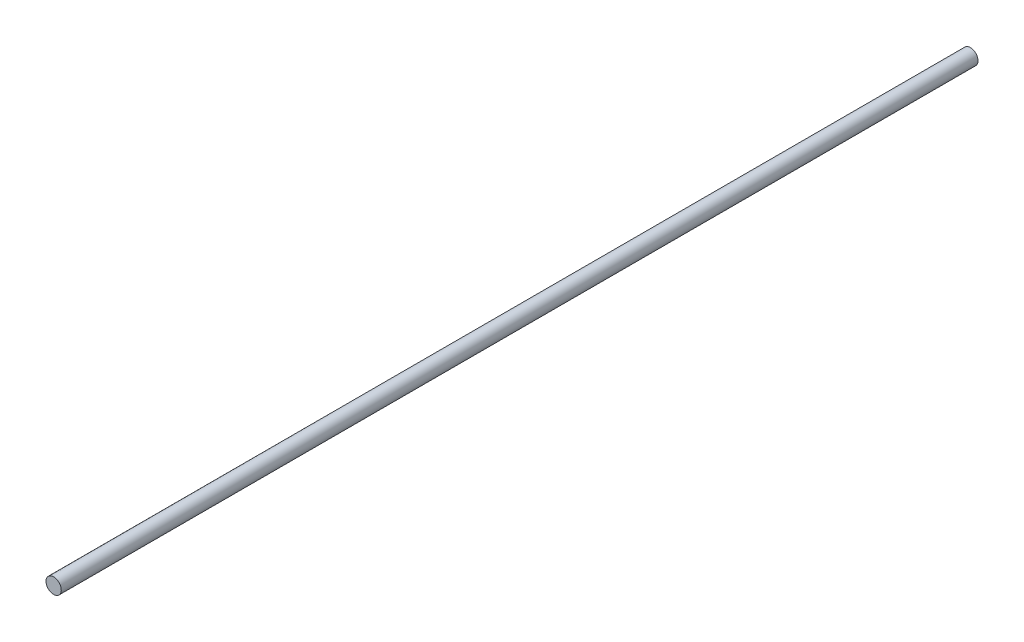
ISO-10303-21;
HEADER;
FILE_DESCRIPTION(('STEP AP214'),'2;1');
FILE_NAME('part.step','',(''),(''),'','','');
FILE_SCHEMA(('AUTOMOTIVE_DESIGN { 1 0 10303 214 1 1 1 1 }'));
ENDSEC;
DATA;
#1=APPLICATION_CONTEXT('core data for automotive mechanical design processes');
#2=APPLICATION_PROTOCOL_DEFINITION('international standard','automotive_design',2000,#1);
#3=PRODUCT_CONTEXT('',#1,'mechanical');
#4=PRODUCT('Part','Part','',(#3));
#5=PRODUCT_RELATED_PRODUCT_CATEGORY('part','',(#4));
#6=PRODUCT_DEFINITION_FORMATION('','',#4);
#7=PRODUCT_DEFINITION_CONTEXT('part definition',#1,'design');
#8=PRODUCT_DEFINITION('design','',#6,#7);
#9=PRODUCT_DEFINITION_SHAPE('','',#8);
#10=(LENGTH_UNIT() NAMED_UNIT(*) SI_UNIT(.MILLI.,.METRE.));
#11=(NAMED_UNIT(*) PLANE_ANGLE_UNIT() SI_UNIT($,.RADIAN.));
#12=(NAMED_UNIT(*) SI_UNIT($,.STERADIAN.) SOLID_ANGLE_UNIT());
#13=UNCERTAINTY_MEASURE_WITH_UNIT(LENGTH_MEASURE(1.E-05),#10,'distance_accuracy_value','');
#14=(GEOMETRIC_REPRESENTATION_CONTEXT(3) GLOBAL_UNCERTAINTY_ASSIGNED_CONTEXT((#13)) GLOBAL_UNIT_ASSIGNED_CONTEXT((#10,
#11,#12)) REPRESENTATION_CONTEXT('',''));
#15=CARTESIAN_POINT('',(0.,0.,0.));
#16=DIRECTION('',(0.,0.,1.));
#17=DIRECTION('',(1.,0.,0.));
#18=AXIS2_PLACEMENT_3D('',#15,#16,#17);
#19=CARTESIAN_POINT('',(0.,0.,600.));
#20=DIRECTION('',(0.,0.,-1.));
#21=DIRECTION('',(-1.,0.,0.));
#22=AXIS2_PLACEMENT_3D('',#19,#20,#21);
#23=CYLINDRICAL_SURFACE('',#22,5.);
#24=CARTESIAN_POINT('',(0.,0.,600.));
#25=DIRECTION('',(0.,0.,1.));
#26=DIRECTION('',(1.,0.,0.));
#27=AXIS2_PLACEMENT_3D('',#24,#25,#26);
#28=CIRCLE('',#27,5.);
#29=CARTESIAN_POINT('',(5.,0.,600.));
#30=VERTEX_POINT('',#29);
#31=EDGE_CURVE('E10',#30,#30,#28,.T.);
#32=ORIENTED_EDGE('',*,*,#31,.F.);
#33=EDGE_LOOP('',(#32));
#34=FACE_BOUND('',#33,.T.);
#35=CARTESIAN_POINT('',(0.,0.,0.));
#36=DIRECTION('',(0.,0.,1.));
#37=DIRECTION('',(1.,0.,0.));
#38=AXIS2_PLACEMENT_3D('',#35,#36,#37);
#39=CIRCLE('',#38,5.);
#40=CARTESIAN_POINT('',(5.,0.,0.));
#41=VERTEX_POINT('',#40);
#42=EDGE_CURVE('E35',#41,#41,#39,.T.);
#43=ORIENTED_EDGE('',*,*,#42,.T.);
#44=EDGE_LOOP('',(#43));
#45=FACE_BOUND('',#44,.T.);
#46=ADVANCED_FACE('F32',(#34,#45),#23,.T.);
#47=CARTESIAN_POINT('',(0.,0.,600.));
#48=DIRECTION('',(0.,0.,1.));
#49=DIRECTION('',(1.,0.,0.));
#50=AXIS2_PLACEMENT_3D('',#47,#48,#49);
#51=PLANE('',#50);
#52=ORIENTED_EDGE('',*,*,#31,.T.);
#53=EDGE_LOOP('',(#52));
#54=FACE_BOUND('',#53,.T.);
#55=ADVANCED_FACE('F47',(#54),#51,.T.);
#56=CARTESIAN_POINT('',(0.,0.,0.));
#57=DIRECTION('',(0.,0.,1.));
#58=DIRECTION('',(1.,0.,0.));
#59=AXIS2_PLACEMENT_3D('',#56,#57,#58);
#60=PLANE('',#59);
#61=ORIENTED_EDGE('',*,*,#42,.F.);
#62=EDGE_LOOP('',(#61));
#63=FACE_BOUND('',#62,.T.);
#64=ADVANCED_FACE('F45',(#63),#60,.F.);
#65=CLOSED_SHELL('',(#46,#55,#64));
#66=MANIFOLD_SOLID_BREP('B2',#65);
#67=ADVANCED_BREP_SHAPE_REPRESENTATION('',(#18,#66),#14);
#68=SHAPE_DEFINITION_REPRESENTATION(#9,#67);
ENDSEC;
END-ISO-10303-21;
